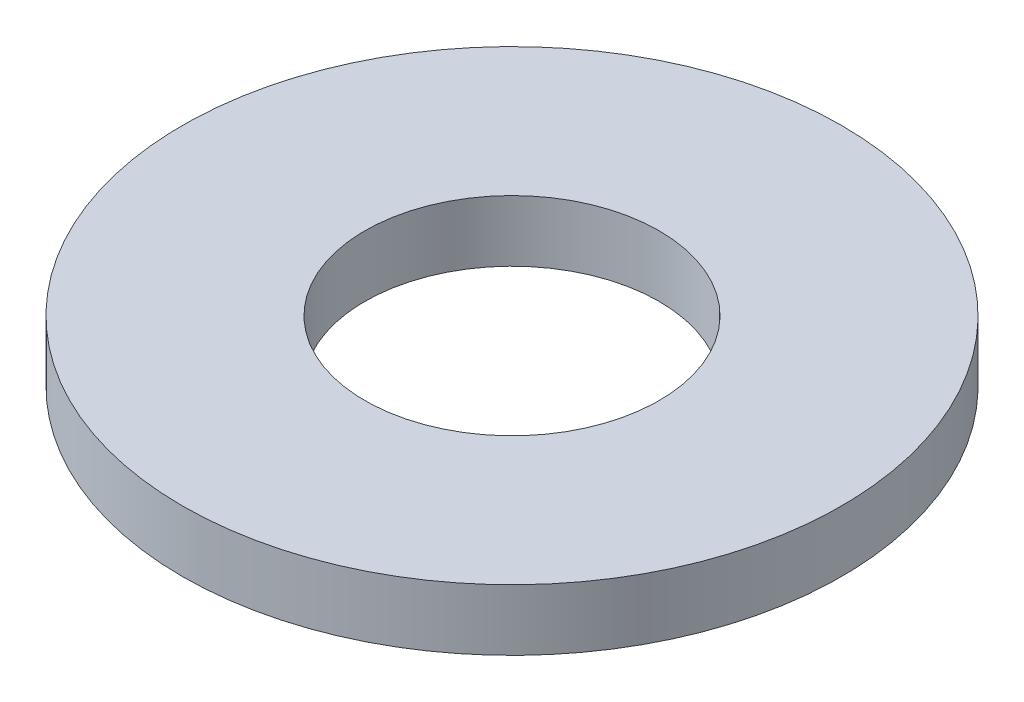
ISO-10303-21;
HEADER;
FILE_DESCRIPTION(('STEP AP214'),'2;1');
FILE_NAME('part.step','',(''),(''),'','','');
FILE_SCHEMA(('AUTOMOTIVE_DESIGN { 1 0 10303 214 1 1 1 1 }'));
ENDSEC;
DATA;
#1=APPLICATION_CONTEXT('core data for automotive mechanical design processes');
#2=APPLICATION_PROTOCOL_DEFINITION('international standard','automotive_design',2000,#1);
#3=PRODUCT_CONTEXT('',#1,'mechanical');
#4=PRODUCT('Part','Part','',(#3));
#5=PRODUCT_RELATED_PRODUCT_CATEGORY('part','',(#4));
#6=PRODUCT_DEFINITION_FORMATION('','',#4);
#7=PRODUCT_DEFINITION_CONTEXT('part definition',#1,'design');
#8=PRODUCT_DEFINITION('design','',#6,#7);
#9=PRODUCT_DEFINITION_SHAPE('','',#8);
#10=(LENGTH_UNIT() NAMED_UNIT(*) SI_UNIT(.MILLI.,.METRE.));
#11=(NAMED_UNIT(*) PLANE_ANGLE_UNIT() SI_UNIT($,.RADIAN.));
#12=(NAMED_UNIT(*) SI_UNIT($,.STERADIAN.) SOLID_ANGLE_UNIT());
#13=UNCERTAINTY_MEASURE_WITH_UNIT(LENGTH_MEASURE(1.E-05),#10,'distance_accuracy_value','');
#14=(GEOMETRIC_REPRESENTATION_CONTEXT(3) GLOBAL_UNCERTAINTY_ASSIGNED_CONTEXT((#13)) GLOBAL_UNIT_ASSIGNED_CONTEXT((#10,
#11,#12)) REPRESENTATION_CONTEXT('',''));
#15=CARTESIAN_POINT('',(0.,0.,0.));
#16=DIRECTION('',(0.,0.,1.));
#17=DIRECTION('',(1.,0.,0.));
#18=AXIS2_PLACEMENT_3D('',#15,#16,#17);
#19=CARTESIAN_POINT('',(0.,1.651,0.));
#20=DIRECTION('',(0.,1.,0.));
#21=DIRECTION('',(0.,0.,1.));
#22=AXIS2_PLACEMENT_3D('',#19,#20,#21);
#23=PLANE('',#22);
#24=CARTESIAN_POINT('',(0.,1.651,0.));
#25=DIRECTION('',(0.,1.,0.));
#26=DIRECTION('',(0.,0.,1.));
#27=AXIS2_PLACEMENT_3D('',#24,#25,#26);
#28=CIRCLE('',#27,8.89);
#29=CARTESIAN_POINT('',(0.,1.651,-8.89));
#30=VERTEX_POINT('',#29);
#31=EDGE_CURVE('E10',#30,#30,#28,.T.);
#32=ORIENTED_EDGE('',*,*,#31,.T.);
#33=EDGE_LOOP('',(#32));
#34=FACE_BOUND('',#33,.T.);
#35=CARTESIAN_POINT('',(0.,1.651,0.));
#36=DIRECTION('',(0.,1.,0.));
#37=DIRECTION('',(0.,0.,1.));
#38=AXIS2_PLACEMENT_3D('',#35,#36,#37);
#39=CIRCLE('',#38,3.96875);
#40=CARTESIAN_POINT('',(0.,1.651,-3.96875));
#41=VERTEX_POINT('',#40);
#42=EDGE_CURVE('E41',#41,#41,#39,.T.);
#43=ORIENTED_EDGE('',*,*,#42,.F.);
#44=EDGE_LOOP('',(#43));
#45=FACE_BOUND('',#44,.T.);
#46=ADVANCED_FACE('F30',(#34,#45),#23,.T.);
#47=CARTESIAN_POINT('',(0.,0.,0.));
#48=DIRECTION('',(0.,1.,0.));
#49=DIRECTION('',(0.,0.,1.));
#50=AXIS2_PLACEMENT_3D('',#47,#48,#49);
#51=PLANE('',#50);
#52=CARTESIAN_POINT('',(0.,0.,0.));
#53=DIRECTION('',(0.,1.,0.));
#54=DIRECTION('',(0.,0.,1.));
#55=AXIS2_PLACEMENT_3D('',#52,#53,#54);
#56=CIRCLE('',#55,8.89);
#57=CARTESIAN_POINT('',(0.,0.,-8.89));
#58=VERTEX_POINT('',#57);
#59=EDGE_CURVE('E34',#58,#58,#56,.T.);
#60=ORIENTED_EDGE('',*,*,#59,.F.);
#61=EDGE_LOOP('',(#60));
#62=FACE_BOUND('',#61,.T.);
#63=CARTESIAN_POINT('',(0.,0.,0.));
#64=DIRECTION('',(0.,1.,0.));
#65=DIRECTION('',(0.,0.,1.));
#66=AXIS2_PLACEMENT_3D('',#63,#64,#65);
#67=CIRCLE('',#66,3.96875);
#68=CARTESIAN_POINT('',(0.,0.,-3.96875));
#69=VERTEX_POINT('',#68);
#70=EDGE_CURVE('E43',#69,#69,#67,.T.);
#71=ORIENTED_EDGE('',*,*,#70,.T.);
#72=EDGE_LOOP('',(#71));
#73=FACE_BOUND('',#72,.T.);
#74=ADVANCED_FACE('F53',(#62,#73),#51,.F.);
#75=CARTESIAN_POINT('',(0.,1.651,0.));
#76=DIRECTION('',(0.,-1.,0.));
#77=DIRECTION('',(0.,0.,-1.));
#78=AXIS2_PLACEMENT_3D('',#75,#76,#77);
#79=CYLINDRICAL_SURFACE('',#78,8.89);
#80=CARTESIAN_POINT('',(0.,1.651,-8.89));
#81=CARTESIAN_POINT('',(0.,1.63380208333333,-8.89));
#82=CARTESIAN_POINT('',(0.,1.61660416666667,-8.89));
#83=CARTESIAN_POINT('',(0.,1.58220833333333,-8.89));
#84=CARTESIAN_POINT('',(0.,1.56501041666667,-8.89));
#85=CARTESIAN_POINT('',(0.,1.53061458333333,-8.89));
#86=CARTESIAN_POINT('',(0.,1.51341666666667,-8.89));
#87=CARTESIAN_POINT('',(0.,1.47902083333333,-8.89));
#88=CARTESIAN_POINT('',(0.,1.46182291666667,-8.89));
#89=CARTESIAN_POINT('',(0.,1.42742708333333,-8.89));
#90=CARTESIAN_POINT('',(0.,1.41022916666667,-8.89));
#91=CARTESIAN_POINT('',(0.,1.37583333333333,-8.89));
#92=CARTESIAN_POINT('',(0.,1.35863541666667,-8.89));
#93=CARTESIAN_POINT('',(0.,1.32423958333333,-8.89));
#94=CARTESIAN_POINT('',(0.,1.30704166666667,-8.89));
#95=CARTESIAN_POINT('',(0.,1.27264583333333,-8.89));
#96=CARTESIAN_POINT('',(0.,1.25544791666667,-8.89));
#97=CARTESIAN_POINT('',(0.,1.22105208333333,-8.89));
#98=CARTESIAN_POINT('',(0.,1.20385416666667,-8.89));
#99=CARTESIAN_POINT('',(0.,1.16945833333333,-8.89));
#100=CARTESIAN_POINT('',(0.,1.15226041666667,-8.89));
#101=CARTESIAN_POINT('',(0.,1.11786458333333,-8.89));
#102=CARTESIAN_POINT('',(0.,1.10066666666667,-8.89));
#103=CARTESIAN_POINT('',(0.,1.06627083333333,-8.89));
#104=CARTESIAN_POINT('',(0.,1.04907291666667,-8.89));
#105=CARTESIAN_POINT('',(0.,1.01467708333333,-8.89));
#106=CARTESIAN_POINT('',(0.,0.997479166666666,-8.89));
#107=CARTESIAN_POINT('',(0.,0.963083333333333,-8.89));
#108=CARTESIAN_POINT('',(0.,0.945885416666666,-8.89));
#109=CARTESIAN_POINT('',(0.,0.911489583333333,-8.89));
#110=CARTESIAN_POINT('',(0.,0.894291666666666,-8.89));
#111=CARTESIAN_POINT('',(0.,0.859895833333333,-8.89));
#112=CARTESIAN_POINT('',(0.,0.842697916666666,-8.89));
#113=CARTESIAN_POINT('',(0.,0.808302083333333,-8.89));
#114=CARTESIAN_POINT('',(0.,0.791104166666666,-8.89));
#115=CARTESIAN_POINT('',(0.,0.756708333333333,-8.89));
#116=CARTESIAN_POINT('',(0.,0.739510416666667,-8.89));
#117=CARTESIAN_POINT('',(0.,0.705114583333333,-8.89));
#118=CARTESIAN_POINT('',(0.,0.687916666666667,-8.89));
#119=CARTESIAN_POINT('',(0.,0.653520833333333,-8.89));
#120=CARTESIAN_POINT('',(0.,0.636322916666667,-8.89));
#121=CARTESIAN_POINT('',(0.,0.601927083333333,-8.89));
#122=CARTESIAN_POINT('',(0.,0.584729166666667,-8.89));
#123=CARTESIAN_POINT('',(0.,0.550333333333333,-8.89));
#124=CARTESIAN_POINT('',(0.,0.533135416666667,-8.89));
#125=CARTESIAN_POINT('',(0.,0.498739583333333,-8.89));
#126=CARTESIAN_POINT('',(0.,0.481541666666667,-8.89));
#127=CARTESIAN_POINT('',(0.,0.447145833333333,-8.89));
#128=CARTESIAN_POINT('',(0.,0.429947916666667,-8.89));
#129=CARTESIAN_POINT('',(0.,0.395552083333333,-8.89));
#130=CARTESIAN_POINT('',(0.,0.378354166666667,-8.89));
#131=CARTESIAN_POINT('',(0.,0.343958333333333,-8.89));
#132=CARTESIAN_POINT('',(0.,0.326760416666667,-8.89));
#133=CARTESIAN_POINT('',(0.,0.292364583333333,-8.89));
#134=CARTESIAN_POINT('',(0.,0.275166666666667,-8.89));
#135=CARTESIAN_POINT('',(0.,0.240770833333333,-8.89));
#136=CARTESIAN_POINT('',(0.,0.223572916666667,-8.89));
#137=CARTESIAN_POINT('',(0.,0.189177083333333,-8.89));
#138=CARTESIAN_POINT('',(0.,0.171979166666667,-8.89));
#139=CARTESIAN_POINT('',(0.,0.137583333333333,-8.89));
#140=CARTESIAN_POINT('',(0.,0.120385416666667,-8.89));
#141=CARTESIAN_POINT('',(0.,0.0859895833333333,-8.89));
#142=CARTESIAN_POINT('',(0.,0.0687916666666667,-8.89));
#143=CARTESIAN_POINT('',(0.,0.0343958333333333,-8.89));
#144=CARTESIAN_POINT('',(0.,0.0171979166666666,-8.89));
#145=CARTESIAN_POINT('',(0.,0.,-8.89));
#146=B_SPLINE_CURVE_WITH_KNOTS('',3,(#80,#81,#82,#83,#84,#85,#86,#87,#88,#89,#90,#91,#92,#93,
#94,#95,#96,#97,#98,#99,#100,#101,#102,#103,#104,#105,#106,#107,#108,#109,#110,#111,#112,#113,
#114,#115,#116,#117,#118,#119,#120,#121,#122,#123,#124,#125,#126,#127,#128,#129,#130,#131,#132,
#133,#134,#135,#136,#137,#138,#139,#140,#141,#142,#143,#144,#145),.UNSPECIFIED.,.F.,.F.,(4,2,2,
2,2,2,2,2,2,2,2,2,2,2,2,2,2,2,2,2,2,2,2,2,2,2,2,2,2,2,2,2,4),(0.,0.0515937500000002,0.1031875,
0.15478125,0.206375,0.25796875,0.3095625,0.36115625,0.41275,0.46434375,0.5159375,0.56753125,
0.619125,0.67071875,0.7223125,0.77390625,0.8255,0.87709375,0.9286875,0.98028125,1.031875,
1.08346875,1.1350625,1.18665625,1.23825,1.28984375,1.3414375,1.39303125,1.444625,1.49621875,
1.5478125,1.59940625,1.651),.UNSPECIFIED.);
#147=EDGE_CURVE('BSEAM32',#30,#58,#146,.T.);
#148=ORIENTED_EDGE('',*,*,#31,.F.);
#149=ORIENTED_EDGE('',*,*,#59,.T.);
#150=ORIENTED_EDGE('',*,*,#147,.T.);
#151=ORIENTED_EDGE('',*,*,#147,.F.);
#152=EDGE_LOOP('',(#148,#150,#149,#151));
#153=FACE_BOUND('',#152,.T.);
#154=ADVANCED_FACE('F32',(#153),#79,.T.);
#155=CARTESIAN_POINT('',(0.,1.651,0.));
#156=DIRECTION('',(0.,-1.,0.));
#157=DIRECTION('',(0.,0.,-1.));
#158=AXIS2_PLACEMENT_3D('',#155,#156,#157);
#159=CYLINDRICAL_SURFACE('',#158,3.96875);
#160=CARTESIAN_POINT('',(0.,1.651,-3.96875));
#161=CARTESIAN_POINT('',(0.,1.63380208333333,-3.96875));
#162=CARTESIAN_POINT('',(0.,1.61660416666667,-3.96875));
#163=CARTESIAN_POINT('',(0.,1.58220833333333,-3.96875));
#164=CARTESIAN_POINT('',(0.,1.56501041666667,-3.96875));
#165=CARTESIAN_POINT('',(0.,1.53061458333333,-3.96875));
#166=CARTESIAN_POINT('',(0.,1.51341666666667,-3.96875));
#167=CARTESIAN_POINT('',(0.,1.47902083333333,-3.96875));
#168=CARTESIAN_POINT('',(0.,1.46182291666667,-3.96875));
#169=CARTESIAN_POINT('',(0.,1.42742708333333,-3.96875));
#170=CARTESIAN_POINT('',(0.,1.41022916666667,-3.96875));
#171=CARTESIAN_POINT('',(0.,1.37583333333333,-3.96875));
#172=CARTESIAN_POINT('',(0.,1.35863541666667,-3.96875));
#173=CARTESIAN_POINT('',(0.,1.32423958333333,-3.96875));
#174=CARTESIAN_POINT('',(0.,1.30704166666667,-3.96875));
#175=CARTESIAN_POINT('',(0.,1.27264583333333,-3.96875));
#176=CARTESIAN_POINT('',(0.,1.25544791666667,-3.96875));
#177=CARTESIAN_POINT('',(0.,1.22105208333333,-3.96875));
#178=CARTESIAN_POINT('',(0.,1.20385416666667,-3.96875));
#179=CARTESIAN_POINT('',(0.,1.16945833333333,-3.96875));
#180=CARTESIAN_POINT('',(0.,1.15226041666667,-3.96875));
#181=CARTESIAN_POINT('',(0.,1.11786458333333,-3.96875));
#182=CARTESIAN_POINT('',(0.,1.10066666666667,-3.96875));
#183=CARTESIAN_POINT('',(0.,1.06627083333333,-3.96875));
#184=CARTESIAN_POINT('',(0.,1.04907291666667,-3.96875));
#185=CARTESIAN_POINT('',(0.,1.01467708333333,-3.96875));
#186=CARTESIAN_POINT('',(0.,0.997479166666666,-3.96875));
#187=CARTESIAN_POINT('',(0.,0.963083333333333,-3.96875));
#188=CARTESIAN_POINT('',(0.,0.945885416666666,-3.96875));
#189=CARTESIAN_POINT('',(0.,0.911489583333333,-3.96875));
#190=CARTESIAN_POINT('',(0.,0.894291666666666,-3.96875));
#191=CARTESIAN_POINT('',(0.,0.859895833333333,-3.96875));
#192=CARTESIAN_POINT('',(0.,0.842697916666666,-3.96875));
#193=CARTESIAN_POINT('',(0.,0.808302083333333,-3.96875));
#194=CARTESIAN_POINT('',(0.,0.791104166666666,-3.96875));
#195=CARTESIAN_POINT('',(0.,0.756708333333333,-3.96875));
#196=CARTESIAN_POINT('',(0.,0.739510416666667,-3.96875));
#197=CARTESIAN_POINT('',(0.,0.705114583333333,-3.96875));
#198=CARTESIAN_POINT('',(0.,0.687916666666667,-3.96875));
#199=CARTESIAN_POINT('',(0.,0.653520833333333,-3.96875));
#200=CARTESIAN_POINT('',(0.,0.636322916666667,-3.96875));
#201=CARTESIAN_POINT('',(0.,0.601927083333333,-3.96875));
#202=CARTESIAN_POINT('',(0.,0.584729166666667,-3.96875));
#203=CARTESIAN_POINT('',(0.,0.550333333333333,-3.96875));
#204=CARTESIAN_POINT('',(0.,0.533135416666667,-3.96875));
#205=CARTESIAN_POINT('',(0.,0.498739583333333,-3.96875));
#206=CARTESIAN_POINT('',(0.,0.481541666666667,-3.96875));
#207=CARTESIAN_POINT('',(0.,0.447145833333333,-3.96875));
#208=CARTESIAN_POINT('',(0.,0.429947916666667,-3.96875));
#209=CARTESIAN_POINT('',(0.,0.395552083333333,-3.96875));
#210=CARTESIAN_POINT('',(0.,0.378354166666667,-3.96875));
#211=CARTESIAN_POINT('',(0.,0.343958333333333,-3.96875));
#212=CARTESIAN_POINT('',(0.,0.326760416666667,-3.96875));
#213=CARTESIAN_POINT('',(0.,0.292364583333333,-3.96875));
#214=CARTESIAN_POINT('',(0.,0.275166666666667,-3.96875));
#215=CARTESIAN_POINT('',(0.,0.240770833333333,-3.96875));
#216=CARTESIAN_POINT('',(0.,0.223572916666667,-3.96875));
#217=CARTESIAN_POINT('',(0.,0.189177083333333,-3.96875));
#218=CARTESIAN_POINT('',(0.,0.171979166666667,-3.96875));
#219=CARTESIAN_POINT('',(0.,0.137583333333333,-3.96875));
#220=CARTESIAN_POINT('',(0.,0.120385416666667,-3.96875));
#221=CARTESIAN_POINT('',(0.,0.0859895833333333,-3.96875));
#222=CARTESIAN_POINT('',(0.,0.0687916666666667,-3.96875));
#223=CARTESIAN_POINT('',(0.,0.0343958333333333,-3.96875));
#224=CARTESIAN_POINT('',(0.,0.0171979166666666,-3.96875));
#225=CARTESIAN_POINT('',(0.,0.,-3.96875));
#226=B_SPLINE_CURVE_WITH_KNOTS('',3,(#160,#161,#162,#163,#164,#165,#166,#167,#168,#169,#170,
#171,#172,#173,#174,#175,#176,#177,#178,#179,#180,#181,#182,#183,#184,#185,#186,#187,#188,#189,
#190,#191,#192,#193,#194,#195,#196,#197,#198,#199,#200,#201,#202,#203,#204,#205,#206,#207,#208,
#209,#210,#211,#212,#213,#214,#215,#216,#217,#218,#219,#220,#221,#222,#223,#224,#225),
.UNSPECIFIED.,.F.,.F.,(4,2,2,2,2,2,2,2,2,2,2,2,2,2,2,2,2,2,2,2,2,2,2,2,2,2,2,2,2,2,2,2,4),(0.,
0.0515937500000002,0.1031875,0.15478125,0.206375,0.25796875,0.3095625,0.36115625,0.41275,
0.46434375,0.5159375,0.56753125,0.619125,0.67071875,0.7223125,0.77390625,0.8255,0.87709375,
0.9286875,0.98028125,1.031875,1.08346875,1.1350625,1.18665625,1.23825,1.28984375,1.3414375,
1.39303125,1.444625,1.49621875,1.5478125,1.59940625,1.651),.UNSPECIFIED.);
#227=EDGE_CURVE('BSEAM49',#41,#69,#226,.T.);
#228=ORIENTED_EDGE('',*,*,#42,.T.);
#229=ORIENTED_EDGE('',*,*,#70,.F.);
#230=ORIENTED_EDGE('',*,*,#227,.T.);
#231=ORIENTED_EDGE('',*,*,#227,.F.);
#232=EDGE_LOOP('',(#228,#230,#229,#231));
#233=FACE_BOUND('',#232,.T.);
#234=ADVANCED_FACE('F49',(#233),#159,.F.);
#235=CLOSED_SHELL('',(#46,#74,#154,#234));
#236=MANIFOLD_SOLID_BREP('B2',#235);
#237=ADVANCED_BREP_SHAPE_REPRESENTATION('',(#18,#236),#14);
#238=SHAPE_DEFINITION_REPRESENTATION(#9,#237);
ENDSEC;
END-ISO-10303-21;
